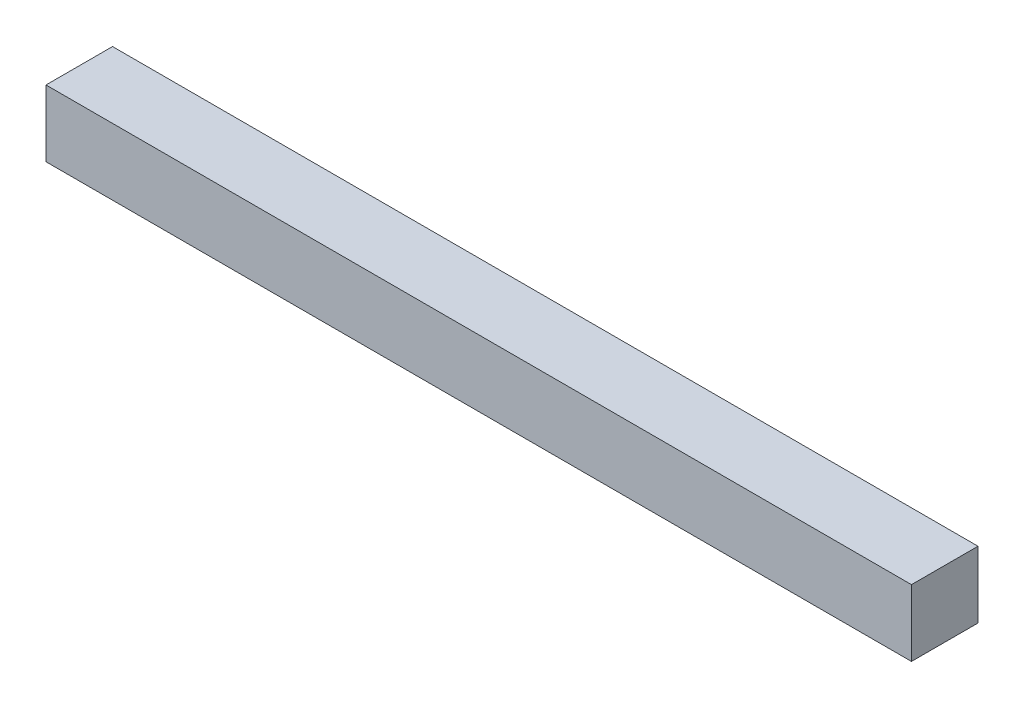
ISO-10303-21;
HEADER;
FILE_DESCRIPTION(('STEP AP214'),'2;1');
FILE_NAME('part.step','',(''),(''),'','','');
FILE_SCHEMA(('AUTOMOTIVE_DESIGN { 1 0 10303 214 1 1 1 1 }'));
ENDSEC;
DATA;
#1=APPLICATION_CONTEXT('core data for automotive mechanical design processes');
#2=APPLICATION_PROTOCOL_DEFINITION('international standard','automotive_design',2000,#1);
#3=PRODUCT_CONTEXT('',#1,'mechanical');
#4=PRODUCT('Part','Part','',(#3));
#5=PRODUCT_RELATED_PRODUCT_CATEGORY('part','',(#4));
#6=PRODUCT_DEFINITION_FORMATION('','',#4);
#7=PRODUCT_DEFINITION_CONTEXT('part definition',#1,'design');
#8=PRODUCT_DEFINITION('design','',#6,#7);
#9=PRODUCT_DEFINITION_SHAPE('','',#8);
#10=(LENGTH_UNIT() NAMED_UNIT(*) SI_UNIT(.MILLI.,.METRE.));
#11=(NAMED_UNIT(*) PLANE_ANGLE_UNIT() SI_UNIT($,.RADIAN.));
#12=(NAMED_UNIT(*) SI_UNIT($,.STERADIAN.) SOLID_ANGLE_UNIT());
#13=UNCERTAINTY_MEASURE_WITH_UNIT(LENGTH_MEASURE(1.E-05),#10,'distance_accuracy_value','');
#14=(GEOMETRIC_REPRESENTATION_CONTEXT(3) GLOBAL_UNCERTAINTY_ASSIGNED_CONTEXT((#13)) GLOBAL_UNIT_ASSIGNED_CONTEXT((#10,
#11,#12)) REPRESENTATION_CONTEXT('',''));
#15=CARTESIAN_POINT('',(0.,0.,0.));
#16=DIRECTION('',(0.,0.,1.));
#17=DIRECTION('',(1.,0.,0.));
#18=AXIS2_PLACEMENT_3D('',#15,#16,#17);
#19=CARTESIAN_POINT('',(0.,123.,123.));
#20=DIRECTION('',(1.,0.,0.));
#21=DIRECTION('',(0.,1.,0.));
#22=AXIS2_PLACEMENT_3D('',#19,#20,#21);
#23=PLANE('',#22);
#24=DIRECTION('',(0.,-1.,0.));
#25=VECTOR('',#24,1.);
#26=CARTESIAN_POINT('',(0.,123.,0.));
#27=LINE('',#26,#25);
#28=CARTESIAN_POINT('',(0.,123.,0.));
#29=VERTEX_POINT('',#28);
#30=CARTESIAN_POINT('',(0.,0.,0.));
#31=VERTEX_POINT('',#30);
#32=EDGE_CURVE('E95',#29,#31,#27,.T.);
#33=ORIENTED_EDGE('',*,*,#32,.T.);
#34=DIRECTION('',(0.,0.,-1.));
#35=VECTOR('',#34,1.);
#36=CARTESIAN_POINT('',(0.,0.,123.));
#37=LINE('',#36,#35);
#38=CARTESIAN_POINT('',(0.,0.,123.));
#39=VERTEX_POINT('',#38);
#40=EDGE_CURVE('E11',#39,#31,#37,.T.);
#41=ORIENTED_EDGE('',*,*,#40,.F.);
#42=DIRECTION('',(0.,-1.,0.));
#43=VECTOR('',#42,1.);
#44=CARTESIAN_POINT('',(0.,123.,123.));
#45=LINE('',#44,#43);
#46=CARTESIAN_POINT('',(0.,123.,123.));
#47=VERTEX_POINT('',#46);
#48=EDGE_CURVE('E83',#47,#39,#45,.T.);
#49=ORIENTED_EDGE('',*,*,#48,.F.);
#50=DIRECTION('',(0.,0.,-1.));
#51=VECTOR('',#50,1.);
#52=CARTESIAN_POINT('',(0.,123.,123.));
#53=LINE('',#52,#51);
#54=EDGE_CURVE('E91',#47,#29,#53,.T.);
#55=ORIENTED_EDGE('',*,*,#54,.T.);
#56=EDGE_LOOP('',(#33,#41,#49,#55));
#57=FACE_BOUND('',#56,.T.);
#58=ADVANCED_FACE('F32',(#57),#23,.F.);
#59=CARTESIAN_POINT('',(0.,0.,123.));
#60=DIRECTION('',(0.,1.,0.));
#61=DIRECTION('',(0.,0.,1.));
#62=AXIS2_PLACEMENT_3D('',#59,#60,#61);
#63=PLANE('',#62);
#64=DIRECTION('',(1.,0.,0.));
#65=VECTOR('',#64,1.);
#66=CARTESIAN_POINT('',(0.,0.,0.));
#67=LINE('',#66,#65);
#68=CARTESIAN_POINT('',(1600.,0.,0.));
#69=VERTEX_POINT('',#68);
#70=EDGE_CURVE('E87',#31,#69,#67,.T.);
#71=ORIENTED_EDGE('',*,*,#70,.T.);
#72=DIRECTION('',(0.,0.,-1.));
#73=VECTOR('',#72,1.);
#74=CARTESIAN_POINT('',(1600.,0.,123.));
#75=LINE('',#74,#73);
#76=CARTESIAN_POINT('',(1600.,0.,123.));
#77=VERTEX_POINT('',#76);
#78=EDGE_CURVE('E40',#77,#69,#75,.T.);
#79=ORIENTED_EDGE('',*,*,#78,.F.);
#80=DIRECTION('',(1.,0.,0.));
#81=VECTOR('',#80,1.);
#82=CARTESIAN_POINT('',(0.,0.,123.));
#83=LINE('',#82,#81);
#84=EDGE_CURVE('E78',#39,#77,#83,.T.);
#85=ORIENTED_EDGE('',*,*,#84,.F.);
#86=ORIENTED_EDGE('',*,*,#40,.T.);
#87=EDGE_LOOP('',(#71,#79,#85,#86));
#88=FACE_BOUND('',#87,.T.);
#89=ADVANCED_FACE('F86',(#88),#63,.F.);
#90=CARTESIAN_POINT('',(1600.,123.,123.));
#91=DIRECTION('',(-1.,0.,0.));
#92=DIRECTION('',(0.,0.,1.));
#93=AXIS2_PLACEMENT_3D('',#90,#91,#92);
#94=PLANE('',#93);
#95=DIRECTION('',(0.,1.,0.));
#96=VECTOR('',#95,1.);
#97=CARTESIAN_POINT('',(1600.,123.,0.));
#98=LINE('',#97,#96);
#99=CARTESIAN_POINT('',(1600.,123.,0.));
#100=VERTEX_POINT('',#99);
#101=EDGE_CURVE('E65',#69,#100,#98,.T.);
#102=ORIENTED_EDGE('',*,*,#101,.T.);
#103=DIRECTION('',(0.,0.,-1.));
#104=VECTOR('',#103,1.);
#105=CARTESIAN_POINT('',(1600.,123.,123.));
#106=LINE('',#105,#104);
#107=CARTESIAN_POINT('',(1600.,123.,123.));
#108=VERTEX_POINT('',#107);
#109=EDGE_CURVE('E88',#108,#100,#106,.T.);
#110=ORIENTED_EDGE('',*,*,#109,.F.);
#111=DIRECTION('',(0.,1.,0.));
#112=VECTOR('',#111,1.);
#113=CARTESIAN_POINT('',(1600.,123.,123.));
#114=LINE('',#113,#112);
#115=EDGE_CURVE('E81',#77,#108,#114,.T.);
#116=ORIENTED_EDGE('',*,*,#115,.F.);
#117=ORIENTED_EDGE('',*,*,#78,.T.);
#118=EDGE_LOOP('',(#102,#110,#116,#117));
#119=FACE_BOUND('',#118,.T.);
#120=ADVANCED_FACE('F89',(#119),#94,.F.);
#121=CARTESIAN_POINT('',(0.,123.,123.));
#122=DIRECTION('',(0.,-1.,0.));
#123=DIRECTION('',(0.,0.,-1.));
#124=AXIS2_PLACEMENT_3D('',#121,#122,#123);
#125=PLANE('',#124);
#126=DIRECTION('',(-1.,0.,0.));
#127=VECTOR('',#126,1.);
#128=CARTESIAN_POINT('',(0.,123.,0.));
#129=LINE('',#128,#127);
#130=EDGE_CURVE('E71',#100,#29,#129,.T.);
#131=ORIENTED_EDGE('',*,*,#130,.T.);
#132=ORIENTED_EDGE('',*,*,#54,.F.);
#133=DIRECTION('',(-1.,0.,0.));
#134=VECTOR('',#133,1.);
#135=CARTESIAN_POINT('',(0.,123.,123.));
#136=LINE('',#135,#134);
#137=EDGE_CURVE('E48',#108,#47,#136,.T.);
#138=ORIENTED_EDGE('',*,*,#137,.F.);
#139=ORIENTED_EDGE('',*,*,#109,.T.);
#140=EDGE_LOOP('',(#131,#132,#138,#139));
#141=FACE_BOUND('',#140,.T.);
#142=ADVANCED_FACE('F102',(#141),#125,.F.);
#143=CARTESIAN_POINT('',(0.,0.,123.));
#144=DIRECTION('',(0.,0.,1.));
#145=DIRECTION('',(1.,0.,0.));
#146=AXIS2_PLACEMENT_3D('',#143,#144,#145);
#147=PLANE('',#146);
#148=ORIENTED_EDGE('',*,*,#48,.T.);
#149=ORIENTED_EDGE('',*,*,#84,.T.);
#150=ORIENTED_EDGE('',*,*,#115,.T.);
#151=ORIENTED_EDGE('',*,*,#137,.T.);
#152=EDGE_LOOP('',(#148,#149,#150,#151));
#153=FACE_BOUND('',#152,.T.);
#154=ADVANCED_FACE('F79',(#153),#147,.T.);
#155=CARTESIAN_POINT('',(0.,0.,0.));
#156=DIRECTION('',(0.,0.,1.));
#157=DIRECTION('',(1.,0.,0.));
#158=AXIS2_PLACEMENT_3D('',#155,#156,#157);
#159=PLANE('',#158);
#160=ORIENTED_EDGE('',*,*,#32,.F.);
#161=ORIENTED_EDGE('',*,*,#130,.F.);
#162=ORIENTED_EDGE('',*,*,#101,.F.);
#163=ORIENTED_EDGE('',*,*,#70,.F.);
#164=EDGE_LOOP('',(#160,#161,#162,#163));
#165=FACE_BOUND('',#164,.T.);
#166=ADVANCED_FACE('F105',(#165),#159,.F.);
#167=CLOSED_SHELL('',(#58,#89,#120,#142,#154,#166));
#168=MANIFOLD_SOLID_BREP('B2',#167);
#169=ADVANCED_BREP_SHAPE_REPRESENTATION('',(#18,#168),#14);
#170=SHAPE_DEFINITION_REPRESENTATION(#9,#169);
ENDSEC;
END-ISO-10303-21;
